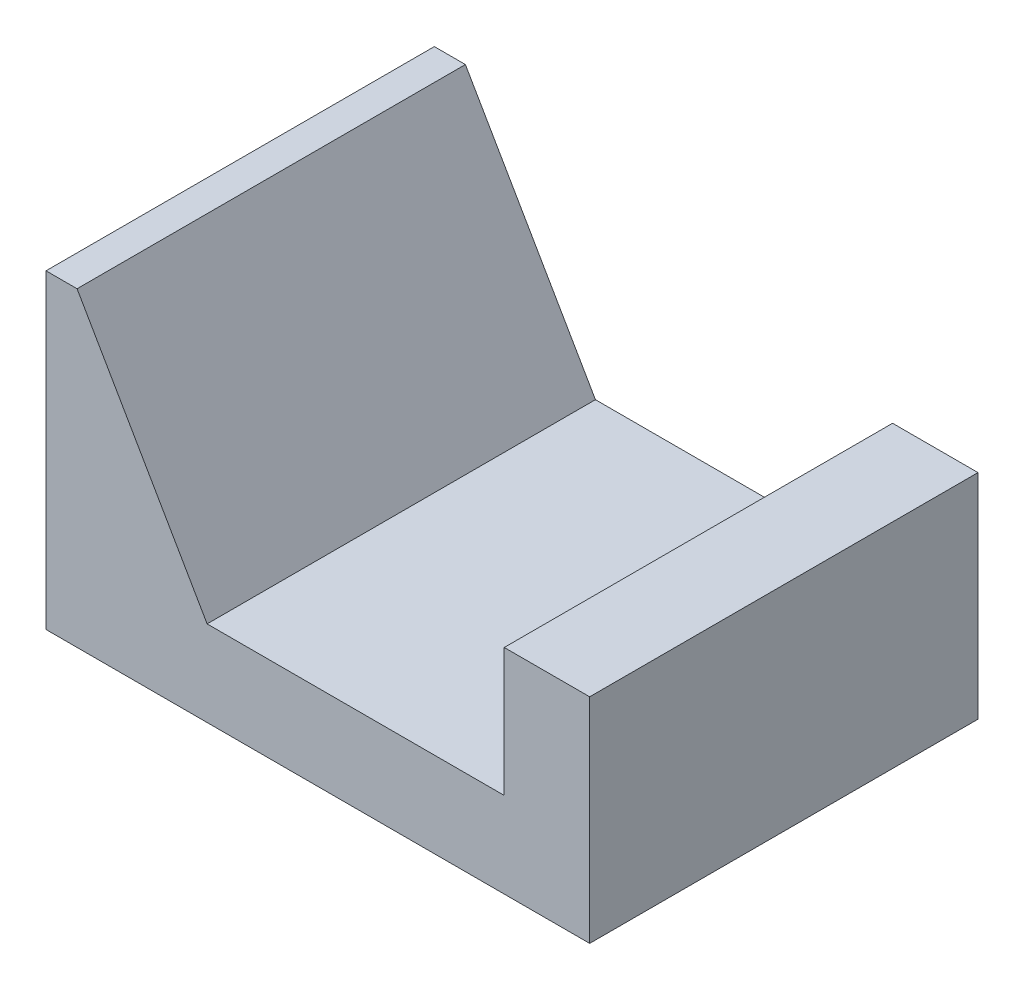
ISO-10303-21;
HEADER;
FILE_DESCRIPTION(('STEP AP214'),'2;1');
FILE_NAME('part.step','',(''),(''),'','','');
FILE_SCHEMA(('AUTOMOTIVE_DESIGN { 1 0 10303 214 1 1 1 1 }'));
ENDSEC;
DATA;
#1=APPLICATION_CONTEXT('core data for automotive mechanical design processes');
#2=APPLICATION_PROTOCOL_DEFINITION('international standard','automotive_design',2000,#1);
#3=PRODUCT_CONTEXT('',#1,'mechanical');
#4=PRODUCT('Part','Part','',(#3));
#5=PRODUCT_RELATED_PRODUCT_CATEGORY('part','',(#4));
#6=PRODUCT_DEFINITION_FORMATION('','',#4);
#7=PRODUCT_DEFINITION_CONTEXT('part definition',#1,'design');
#8=PRODUCT_DEFINITION('design','',#6,#7);
#9=PRODUCT_DEFINITION_SHAPE('','',#8);
#10=(LENGTH_UNIT() NAMED_UNIT(*) SI_UNIT(.MILLI.,.METRE.));
#11=(NAMED_UNIT(*) PLANE_ANGLE_UNIT() SI_UNIT($,.RADIAN.));
#12=(NAMED_UNIT(*) SI_UNIT($,.STERADIAN.) SOLID_ANGLE_UNIT());
#13=UNCERTAINTY_MEASURE_WITH_UNIT(LENGTH_MEASURE(1.E-05),#10,'distance_accuracy_value','');
#14=(GEOMETRIC_REPRESENTATION_CONTEXT(3) GLOBAL_UNCERTAINTY_ASSIGNED_CONTEXT((#13)) GLOBAL_UNIT_ASSIGNED_CONTEXT((#10,
#11,#12)) REPRESENTATION_CONTEXT('',''));
#15=CARTESIAN_POINT('',(0.,0.,0.));
#16=DIRECTION('',(0.,0.,1.));
#17=DIRECTION('',(1.,0.,0.));
#18=AXIS2_PLACEMENT_3D('',#15,#16,#17);
#19=CARTESIAN_POINT('',(0.,8.8,0.));
#20=DIRECTION('',(1.,0.,0.));
#21=DIRECTION('',(0.,0.,-1.));
#22=AXIS2_PLACEMENT_3D('',#19,#20,#21);
#23=PLANE('',#22);
#24=DIRECTION('',(0.,0.,1.));
#25=VECTOR('',#24,1.);
#26=CARTESIAN_POINT('',(0.,0.,0.));
#27=LINE('',#26,#25);
#28=CARTESIAN_POINT('',(0.,0.,-40.));
#29=VERTEX_POINT('',#28);
#30=CARTESIAN_POINT('',(0.,0.,0.));
#31=VERTEX_POINT('',#30);
#32=EDGE_CURVE('E144',#29,#31,#27,.T.);
#33=ORIENTED_EDGE('',*,*,#32,.T.);
#34=DIRECTION('',(0.,-1.,0.));
#35=VECTOR('',#34,1.);
#36=CARTESIAN_POINT('',(0.,8.8,0.));
#37=LINE('',#36,#35);
#38=CARTESIAN_POINT('',(0.,32.,0.));
#39=VERTEX_POINT('',#38);
#40=EDGE_CURVE('E11',#39,#31,#37,.T.);
#41=ORIENTED_EDGE('',*,*,#40,.F.);
#42=DIRECTION('',(0.,0.,1.));
#43=VECTOR('',#42,1.);
#44=CARTESIAN_POINT('',(0.,32.,-68.5239951848019));
#45=LINE('',#44,#43);
#46=CARTESIAN_POINT('',(0.,32.,-40.));
#47=VERTEX_POINT('',#46);
#48=EDGE_CURVE('E132',#47,#39,#45,.T.);
#49=ORIENTED_EDGE('',*,*,#48,.F.);
#50=DIRECTION('',(0.,-1.,0.));
#51=VECTOR('',#50,1.);
#52=CARTESIAN_POINT('',(0.,8.8,-40.));
#53=LINE('',#52,#51);
#54=EDGE_CURVE('E112',#47,#29,#53,.T.);
#55=ORIENTED_EDGE('',*,*,#54,.T.);
#56=EDGE_LOOP('',(#33,#41,#49,#55));
#57=FACE_BOUND('',#56,.T.);
#58=ADVANCED_FACE('F39',(#57),#23,.F.);
#59=CARTESIAN_POINT('',(0.,8.8,0.));
#60=DIRECTION('',(0.,0.,-1.));
#61=DIRECTION('',(-1.,0.,0.));
#62=AXIS2_PLACEMENT_3D('',#59,#60,#61);
#63=PLANE('',#62);
#64=DIRECTION('',(1.,0.,0.));
#65=VECTOR('',#64,1.);
#66=CARTESIAN_POINT('',(0.,0.,0.));
#67=LINE('',#66,#65);
#68=CARTESIAN_POINT('',(56.,0.,0.));
#69=VERTEX_POINT('',#68);
#70=EDGE_CURVE('E149',#31,#69,#67,.T.);
#71=ORIENTED_EDGE('',*,*,#70,.T.);
#72=DIRECTION('',(0.,-1.,0.));
#73=VECTOR('',#72,1.);
#74=CARTESIAN_POINT('',(56.,8.8,0.));
#75=LINE('',#74,#73);
#76=CARTESIAN_POINT('',(56.,22.,0.));
#77=VERTEX_POINT('',#76);
#78=EDGE_CURVE('E46',#77,#69,#75,.T.);
#79=ORIENTED_EDGE('',*,*,#78,.F.);
#80=DIRECTION('',(-1.,0.,0.));
#81=VECTOR('',#80,1.);
#82=CARTESIAN_POINT('',(56.,22.,0.));
#83=LINE('',#82,#81);
#84=CARTESIAN_POINT('',(47.2,22.,0.));
#85=VERTEX_POINT('',#84);
#86=EDGE_CURVE('E128',#77,#85,#83,.T.);
#87=ORIENTED_EDGE('',*,*,#86,.T.);
#88=DIRECTION('',(0.,-1.,0.));
#89=VECTOR('',#88,1.);
#90=CARTESIAN_POINT('',(47.2,8.8,0.));
#91=LINE('',#90,#89);
#92=CARTESIAN_POINT('',(47.2,8.8,0.));
#93=VERTEX_POINT('',#92);
#94=EDGE_CURVE('E180',#85,#93,#91,.T.);
#95=ORIENTED_EDGE('',*,*,#94,.T.);
#96=DIRECTION('',(1.,0.,0.));
#97=VECTOR('',#96,1.);
#98=CARTESIAN_POINT('',(0.,8.8,0.));
#99=LINE('',#98,#97);
#100=CARTESIAN_POINT('',(16.5945262451991,8.8,0.));
#101=VERTEX_POINT('',#100);
#102=EDGE_CURVE('E53',#101,#93,#99,.T.);
#103=ORIENTED_EDGE('',*,*,#102,.F.);
#104=DIRECTION('',(-0.499999999999995,0.866025403784442,0.));
#105=VECTOR('',#104,1.);
#106=CARTESIAN_POINT('',(3.2,32.,0.));
#107=LINE('',#106,#105);
#108=CARTESIAN_POINT('',(3.2,32.,0.));
#109=VERTEX_POINT('',#108);
#110=EDGE_CURVE('E61',#101,#109,#107,.T.);
#111=ORIENTED_EDGE('',*,*,#110,.T.);
#112=DIRECTION('',(-1.,0.,0.));
#113=VECTOR('',#112,1.);
#114=CARTESIAN_POINT('',(0.,32.,0.));
#115=LINE('',#114,#113);
#116=EDGE_CURVE('E134',#109,#39,#115,.T.);
#117=ORIENTED_EDGE('',*,*,#116,.T.);
#118=ORIENTED_EDGE('',*,*,#40,.T.);
#119=EDGE_LOOP('',(#71,#79,#87,#95,#103,#111,#117,#118));
#120=FACE_BOUND('',#119,.T.);
#121=ADVANCED_FACE('F179',(#120),#63,.F.);
#122=CARTESIAN_POINT('',(56.,8.8,0.));
#123=DIRECTION('',(-1.,0.,0.));
#124=DIRECTION('',(0.,0.,1.));
#125=AXIS2_PLACEMENT_3D('',#122,#123,#124);
#126=PLANE('',#125);
#127=DIRECTION('',(0.,0.,-1.));
#128=VECTOR('',#127,1.);
#129=CARTESIAN_POINT('',(56.,0.,0.));
#130=LINE('',#129,#128);
#131=CARTESIAN_POINT('',(56.,0.,-40.));
#132=VERTEX_POINT('',#131);
#133=EDGE_CURVE('E151',#69,#132,#130,.T.);
#134=ORIENTED_EDGE('',*,*,#133,.T.);
#135=DIRECTION('',(0.,-1.,0.));
#136=VECTOR('',#135,1.);
#137=CARTESIAN_POINT('',(56.,8.8,-40.));
#138=LINE('',#137,#136);
#139=CARTESIAN_POINT('',(56.,22.,-40.));
#140=VERTEX_POINT('',#139);
#141=EDGE_CURVE('E156',#140,#132,#138,.T.);
#142=ORIENTED_EDGE('',*,*,#141,.F.);
#143=DIRECTION('',(0.,0.,1.));
#144=VECTOR('',#143,1.);
#145=CARTESIAN_POINT('',(56.,22.,-68.5239951848019));
#146=LINE('',#145,#144);
#147=EDGE_CURVE('E164',#140,#77,#146,.T.);
#148=ORIENTED_EDGE('',*,*,#147,.T.);
#149=ORIENTED_EDGE('',*,*,#78,.T.);
#150=EDGE_LOOP('',(#134,#142,#148,#149));
#151=FACE_BOUND('',#150,.T.);
#152=ADVANCED_FACE('F162',(#151),#126,.F.);
#153=CARTESIAN_POINT('',(0.,8.8,-40.));
#154=DIRECTION('',(0.,0.,1.));
#155=DIRECTION('',(1.,0.,0.));
#156=AXIS2_PLACEMENT_3D('',#153,#154,#155);
#157=PLANE('',#156);
#158=DIRECTION('',(-1.,0.,0.));
#159=VECTOR('',#158,1.);
#160=CARTESIAN_POINT('',(0.,0.,-40.));
#161=LINE('',#160,#159);
#162=EDGE_CURVE('E145',#132,#29,#161,.T.);
#163=ORIENTED_EDGE('',*,*,#162,.T.);
#164=ORIENTED_EDGE('',*,*,#54,.F.);
#165=DIRECTION('',(1.,0.,0.));
#166=VECTOR('',#165,1.);
#167=CARTESIAN_POINT('',(0.,32.,-40.));
#168=LINE('',#167,#166);
#169=CARTESIAN_POINT('',(3.2,32.,-40.));
#170=VERTEX_POINT('',#169);
#171=EDGE_CURVE('E130',#47,#170,#168,.T.);
#172=ORIENTED_EDGE('',*,*,#171,.T.);
#173=DIRECTION('',(0.499999999999995,-0.866025403784442,0.));
#174=VECTOR('',#173,1.);
#175=CARTESIAN_POINT('',(3.2,32.,-40.));
#176=LINE('',#175,#174);
#177=CARTESIAN_POINT('',(16.5945262451991,8.8,-40.));
#178=VERTEX_POINT('',#177);
#179=EDGE_CURVE('E111',#170,#178,#176,.T.);
#180=ORIENTED_EDGE('',*,*,#179,.T.);
#181=DIRECTION('',(-1.,0.,0.));
#182=VECTOR('',#181,1.);
#183=CARTESIAN_POINT('',(0.,8.8,-40.));
#184=LINE('',#183,#182);
#185=CARTESIAN_POINT('',(47.2,8.8,-40.));
#186=VERTEX_POINT('',#185);
#187=EDGE_CURVE('E104',#186,#178,#184,.T.);
#188=ORIENTED_EDGE('',*,*,#187,.F.);
#189=DIRECTION('',(0.,1.,0.));
#190=VECTOR('',#189,1.);
#191=CARTESIAN_POINT('',(47.2,8.8,-40.));
#192=LINE('',#191,#190);
#193=CARTESIAN_POINT('',(47.2,22.,-40.));
#194=VERTEX_POINT('',#193);
#195=EDGE_CURVE('E108',#186,#194,#192,.T.);
#196=ORIENTED_EDGE('',*,*,#195,.T.);
#197=DIRECTION('',(1.,0.,0.));
#198=VECTOR('',#197,1.);
#199=CARTESIAN_POINT('',(56.,22.,-40.));
#200=LINE('',#199,#198);
#201=EDGE_CURVE('E123',#194,#140,#200,.T.);
#202=ORIENTED_EDGE('',*,*,#201,.T.);
#203=ORIENTED_EDGE('',*,*,#141,.T.);
#204=EDGE_LOOP('',(#163,#164,#172,#180,#188,#196,#202,#203));
#205=FACE_BOUND('',#204,.T.);
#206=ADVANCED_FACE('F105',(#205),#157,.F.);
#207=CARTESIAN_POINT('',(0.,8.8,0.));
#208=DIRECTION('',(0.,-1.,0.));
#209=DIRECTION('',(0.,0.,-1.));
#210=AXIS2_PLACEMENT_3D('',#207,#208,#209);
#211=PLANE('',#210);
#212=ORIENTED_EDGE('',*,*,#102,.T.);
#213=DIRECTION('',(0.,0.,1.));
#214=VECTOR('',#213,1.);
#215=CARTESIAN_POINT('',(47.2,8.8,-68.5239951848019));
#216=LINE('',#215,#214);
#217=EDGE_CURVE('E114',#186,#93,#216,.T.);
#218=ORIENTED_EDGE('',*,*,#217,.F.);
#219=ORIENTED_EDGE('',*,*,#187,.T.);
#220=DIRECTION('',(0.,0.,1.));
#221=VECTOR('',#220,1.);
#222=CARTESIAN_POINT('',(16.5945262451991,8.8,-68.5239951848019));
#223=LINE('',#222,#221);
#224=EDGE_CURVE('E137',#178,#101,#223,.T.);
#225=ORIENTED_EDGE('',*,*,#224,.T.);
#226=EDGE_LOOP('',(#212,#218,#219,#225));
#227=FACE_BOUND('',#226,.T.);
#228=ADVANCED_FACE('F115',(#227),#211,.F.);
#229=CARTESIAN_POINT('',(0.,0.,0.));
#230=DIRECTION('',(0.,-1.,0.));
#231=DIRECTION('',(0.,0.,-1.));
#232=AXIS2_PLACEMENT_3D('',#229,#230,#231);
#233=PLANE('',#232);
#234=ORIENTED_EDGE('',*,*,#32,.F.);
#235=ORIENTED_EDGE('',*,*,#162,.F.);
#236=ORIENTED_EDGE('',*,*,#133,.F.);
#237=ORIENTED_EDGE('',*,*,#70,.F.);
#238=EDGE_LOOP('',(#234,#235,#236,#237));
#239=FACE_BOUND('',#238,.T.);
#240=ADVANCED_FACE('F171',(#239),#233,.T.);
#241=CARTESIAN_POINT('',(0.,32.,-68.5239951848019));
#242=DIRECTION('',(0.,1.,0.));
#243=DIRECTION('',(0.,0.,1.));
#244=AXIS2_PLACEMENT_3D('',#241,#242,#243);
#245=PLANE('',#244);
#246=ORIENTED_EDGE('',*,*,#171,.F.);
#247=ORIENTED_EDGE('',*,*,#48,.T.);
#248=ORIENTED_EDGE('',*,*,#116,.F.);
#249=DIRECTION('',(0.,0.,1.));
#250=VECTOR('',#249,1.);
#251=CARTESIAN_POINT('',(3.2,32.,-68.5239951848019));
#252=LINE('',#251,#250);
#253=EDGE_CURVE('E140',#170,#109,#252,.T.);
#254=ORIENTED_EDGE('',*,*,#253,.F.);
#255=EDGE_LOOP('',(#246,#247,#248,#254));
#256=FACE_BOUND('',#255,.T.);
#257=ADVANCED_FACE('F177',(#256),#245,.T.);
#258=CARTESIAN_POINT('',(3.2,32.,-68.5239951848019));
#259=DIRECTION('',(0.866025403784442,0.499999999999995,0.));
#260=DIRECTION('',(-0.499999999999995,0.866025403784442,0.));
#261=AXIS2_PLACEMENT_3D('',#258,#259,#260);
#262=PLANE('',#261);
#263=ORIENTED_EDGE('',*,*,#179,.F.);
#264=ORIENTED_EDGE('',*,*,#253,.T.);
#265=ORIENTED_EDGE('',*,*,#110,.F.);
#266=ORIENTED_EDGE('',*,*,#224,.F.);
#267=EDGE_LOOP('',(#263,#264,#265,#266));
#268=FACE_BOUND('',#267,.T.);
#269=ADVANCED_FACE('F190',(#268),#262,.T.);
#270=CARTESIAN_POINT('',(47.2,8.8,-68.5239951848019));
#271=DIRECTION('',(-1.,0.,0.));
#272=DIRECTION('',(0.,0.,1.));
#273=AXIS2_PLACEMENT_3D('',#270,#271,#272);
#274=PLANE('',#273);
#275=ORIENTED_EDGE('',*,*,#195,.F.);
#276=ORIENTED_EDGE('',*,*,#217,.T.);
#277=ORIENTED_EDGE('',*,*,#94,.F.);
#278=DIRECTION('',(0.,0.,1.));
#279=VECTOR('',#278,1.);
#280=CARTESIAN_POINT('',(47.2,22.,-68.5239951848019));
#281=LINE('',#280,#279);
#282=EDGE_CURVE('E119',#194,#85,#281,.T.);
#283=ORIENTED_EDGE('',*,*,#282,.F.);
#284=EDGE_LOOP('',(#275,#276,#277,#283));
#285=FACE_BOUND('',#284,.T.);
#286=ADVANCED_FACE('F121',(#285),#274,.T.);
#287=CARTESIAN_POINT('',(56.,22.,-68.5239951848019));
#288=DIRECTION('',(0.,1.,0.));
#289=DIRECTION('',(-1.,0.,0.));
#290=AXIS2_PLACEMENT_3D('',#287,#288,#289);
#291=PLANE('',#290);
#292=ORIENTED_EDGE('',*,*,#201,.F.);
#293=ORIENTED_EDGE('',*,*,#282,.T.);
#294=ORIENTED_EDGE('',*,*,#86,.F.);
#295=ORIENTED_EDGE('',*,*,#147,.F.);
#296=EDGE_LOOP('',(#292,#293,#294,#295));
#297=FACE_BOUND('',#296,.T.);
#298=ADVANCED_FACE('F184',(#297),#291,.T.);
#299=CLOSED_SHELL('',(#58,#121,#152,#206,#228,#240,#257,#269,#286,#298));
#300=MANIFOLD_SOLID_BREP('B2',#299);
#301=ADVANCED_BREP_SHAPE_REPRESENTATION('',(#18,#300),#14);
#302=SHAPE_DEFINITION_REPRESENTATION(#9,#301);
ENDSEC;
END-ISO-10303-21;
